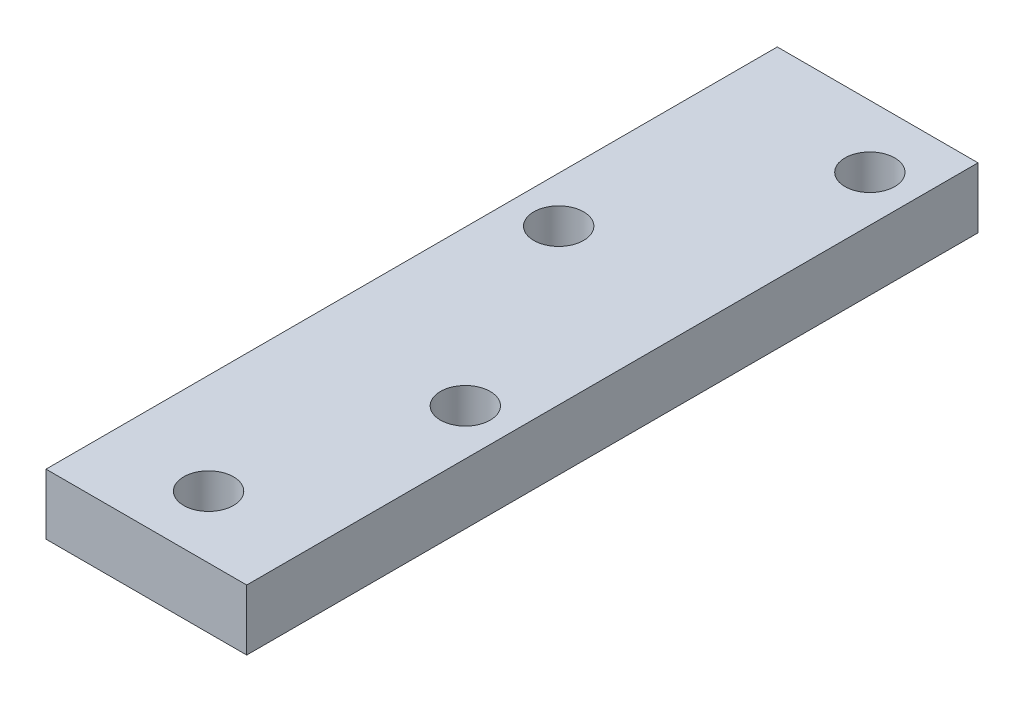
ISO-10303-21;
HEADER;
FILE_DESCRIPTION(('STEP AP214'),'2;1');
FILE_NAME('part.step','',(''),(''),'','','');
FILE_SCHEMA(('AUTOMOTIVE_DESIGN { 1 0 10303 214 1 1 1 1 }'));
ENDSEC;
DATA;
#1=APPLICATION_CONTEXT('core data for automotive mechanical design processes');
#2=APPLICATION_PROTOCOL_DEFINITION('international standard','automotive_design',2000,#1);
#3=PRODUCT_CONTEXT('',#1,'mechanical');
#4=PRODUCT('Part','Part','',(#3));
#5=PRODUCT_RELATED_PRODUCT_CATEGORY('part','',(#4));
#6=PRODUCT_DEFINITION_FORMATION('','',#4);
#7=PRODUCT_DEFINITION_CONTEXT('part definition',#1,'design');
#8=PRODUCT_DEFINITION('design','',#6,#7);
#9=PRODUCT_DEFINITION_SHAPE('','',#8);
#10=(LENGTH_UNIT() NAMED_UNIT(*) SI_UNIT(.MILLI.,.METRE.));
#11=(NAMED_UNIT(*) PLANE_ANGLE_UNIT() SI_UNIT($,.RADIAN.));
#12=(NAMED_UNIT(*) SI_UNIT($,.STERADIAN.) SOLID_ANGLE_UNIT());
#13=UNCERTAINTY_MEASURE_WITH_UNIT(LENGTH_MEASURE(1.E-05),#10,'distance_accuracy_value','');
#14=(GEOMETRIC_REPRESENTATION_CONTEXT(3) GLOBAL_UNCERTAINTY_ASSIGNED_CONTEXT((#13)) GLOBAL_UNIT_ASSIGNED_CONTEXT((#10,
#11,#12)) REPRESENTATION_CONTEXT('',''));
#15=CARTESIAN_POINT('',(0.,0.,0.));
#16=DIRECTION('',(0.,0.,1.));
#17=DIRECTION('',(1.,0.,0.));
#18=AXIS2_PLACEMENT_3D('',#15,#16,#17);
#19=CARTESIAN_POINT('',(-6.45,-1.95,54.));
#20=DIRECTION('',(1.,0.,0.));
#21=DIRECTION('',(0.,0.,-1.));
#22=AXIS2_PLACEMENT_3D('',#19,#20,#21);
#23=PLANE('',#22);
#24=DIRECTION('',(0.,0.,-1.));
#25=VECTOR('',#24,1.);
#26=CARTESIAN_POINT('',(-6.45,1.95,54.));
#27=LINE('',#26,#25);
#28=CARTESIAN_POINT('',(-6.45,1.95,54.));
#29=VERTEX_POINT('',#28);
#30=CARTESIAN_POINT('',(-6.45,1.95,7.00000000000001));
#31=VERTEX_POINT('',#30);
#32=EDGE_CURVE('E91',#29,#31,#27,.T.);
#33=ORIENTED_EDGE('',*,*,#32,.T.);
#34=DIRECTION('',(0.,-1.,0.));
#35=VECTOR('',#34,1.);
#36=CARTESIAN_POINT('',(-6.45,-1.95,7.));
#37=LINE('',#36,#35);
#38=CARTESIAN_POINT('',(-6.45,-1.95,7.));
#39=VERTEX_POINT('',#38);
#40=EDGE_CURVE('E50',#31,#39,#37,.T.);
#41=ORIENTED_EDGE('',*,*,#40,.T.);
#42=DIRECTION('',(0.,0.,-1.));
#43=VECTOR('',#42,1.);
#44=CARTESIAN_POINT('',(-6.45,-1.95,54.));
#45=LINE('',#44,#43);
#46=CARTESIAN_POINT('',(-6.45,-1.95,54.));
#47=VERTEX_POINT('',#46);
#48=EDGE_CURVE('E43',#47,#39,#45,.T.);
#49=ORIENTED_EDGE('',*,*,#48,.F.);
#50=DIRECTION('',(0.,-1.,0.));
#51=VECTOR('',#50,1.);
#52=CARTESIAN_POINT('',(-6.45,-1.95,54.));
#53=LINE('',#52,#51);
#54=EDGE_CURVE('E110',#29,#47,#53,.T.);
#55=ORIENTED_EDGE('',*,*,#54,.F.);
#56=EDGE_LOOP('',(#33,#41,#49,#55));
#57=FACE_BOUND('',#56,.T.);
#58=ADVANCED_FACE('F36',(#57),#23,.F.);
#59=CARTESIAN_POINT('',(6.45,-1.95,54.));
#60=DIRECTION('',(0.,1.,0.));
#61=DIRECTION('',(-1.,0.,0.));
#62=AXIS2_PLACEMENT_3D('',#59,#60,#61);
#63=PLANE('',#62);
#64=CARTESIAN_POINT('',(0.,-1.95,50.));
#65=DIRECTION('',(0.,-1.,0.));
#66=DIRECTION('',(1.,0.,0.));
#67=AXIS2_PLACEMENT_3D('',#64,#65,#66);
#68=CIRCLE('',#67,1.6);
#69=CARTESIAN_POINT('',(1.6,-1.95,50.));
#70=VERTEX_POINT('',#69);
#71=EDGE_CURVE('E126',#70,#70,#68,.T.);
#72=ORIENTED_EDGE('',*,*,#71,.F.);
#73=EDGE_LOOP('',(#72));
#74=FACE_BOUND('',#73,.T.);
#75=CARTESIAN_POINT('',(-3.5,-1.95,24.));
#76=DIRECTION('',(0.,-1.,0.));
#77=DIRECTION('',(1.,0.,0.));
#78=AXIS2_PLACEMENT_3D('',#75,#76,#77);
#79=CIRCLE('',#78,1.6);
#80=CARTESIAN_POINT('',(-1.9,-1.95,24.));
#81=VERTEX_POINT('',#80);
#82=EDGE_CURVE('E132',#81,#81,#79,.T.);
#83=ORIENTED_EDGE('',*,*,#82,.F.);
#84=EDGE_LOOP('',(#83));
#85=FACE_BOUND('',#84,.T.);
#86=CARTESIAN_POINT('',(3.5,-1.95,11.));
#87=DIRECTION('',(0.,-1.,0.));
#88=DIRECTION('',(1.,0.,0.));
#89=AXIS2_PLACEMENT_3D('',#86,#87,#88);
#90=CIRCLE('',#89,1.6);
#91=CARTESIAN_POINT('',(5.1,-1.95,11.));
#92=VERTEX_POINT('',#91);
#93=EDGE_CURVE('E129',#92,#92,#90,.T.);
#94=ORIENTED_EDGE('',*,*,#93,.F.);
#95=EDGE_LOOP('',(#94));
#96=FACE_BOUND('',#95,.T.);
#97=CARTESIAN_POINT('',(3.5,-1.95,37.));
#98=DIRECTION('',(0.,-1.,0.));
#99=DIRECTION('',(1.,0.,0.));
#100=AXIS2_PLACEMENT_3D('',#97,#98,#99);
#101=CIRCLE('',#100,1.6);
#102=CARTESIAN_POINT('',(5.1,-1.95,37.));
#103=VERTEX_POINT('',#102);
#104=EDGE_CURVE('E103',#103,#103,#101,.T.);
#105=ORIENTED_EDGE('',*,*,#104,.F.);
#106=EDGE_LOOP('',(#105));
#107=FACE_BOUND('',#106,.T.);
#108=ORIENTED_EDGE('',*,*,#48,.T.);
#109=DIRECTION('',(1.,0.,0.));
#110=VECTOR('',#109,1.);
#111=CARTESIAN_POINT('',(6.45,-1.95,7.));
#112=LINE('',#111,#110);
#113=CARTESIAN_POINT('',(6.45,-1.95,7.));
#114=VERTEX_POINT('',#113);
#115=EDGE_CURVE('E88',#39,#114,#112,.T.);
#116=ORIENTED_EDGE('',*,*,#115,.T.);
#117=DIRECTION('',(0.,0.,-1.));
#118=VECTOR('',#117,1.);
#119=CARTESIAN_POINT('',(6.45,-1.95,54.));
#120=LINE('',#119,#118);
#121=CARTESIAN_POINT('',(6.45,-1.95,54.));
#122=VERTEX_POINT('',#121);
#123=EDGE_CURVE('E87',#122,#114,#120,.T.);
#124=ORIENTED_EDGE('',*,*,#123,.F.);
#125=DIRECTION('',(1.,0.,0.));
#126=VECTOR('',#125,1.);
#127=CARTESIAN_POINT('',(6.45,-1.95,54.));
#128=LINE('',#127,#126);
#129=EDGE_CURVE('E113',#47,#122,#128,.T.);
#130=ORIENTED_EDGE('',*,*,#129,.F.);
#131=EDGE_LOOP('',(#108,#116,#124,#130));
#132=FACE_BOUND('',#131,.T.);
#133=ADVANCED_FACE('F124',(#74,#85,#96,#107,#132),#63,.F.);
#134=CARTESIAN_POINT('',(6.45,-1.95,54.));
#135=DIRECTION('',(-1.,0.,0.));
#136=DIRECTION('',(0.,0.,1.));
#137=AXIS2_PLACEMENT_3D('',#134,#135,#136);
#138=PLANE('',#137);
#139=ORIENTED_EDGE('',*,*,#123,.T.);
#140=DIRECTION('',(0.,1.,0.));
#141=VECTOR('',#140,1.);
#142=CARTESIAN_POINT('',(6.45,-1.95,7.));
#143=LINE('',#142,#141);
#144=CARTESIAN_POINT('',(6.45,1.95,7.));
#145=VERTEX_POINT('',#144);
#146=EDGE_CURVE('E75',#114,#145,#143,.T.);
#147=ORIENTED_EDGE('',*,*,#146,.T.);
#148=DIRECTION('',(0.,0.,-1.));
#149=VECTOR('',#148,1.);
#150=CARTESIAN_POINT('',(6.45,1.95,54.));
#151=LINE('',#150,#149);
#152=CARTESIAN_POINT('',(6.45,1.95,54.));
#153=VERTEX_POINT('',#152);
#154=EDGE_CURVE('E85',#153,#145,#151,.T.);
#155=ORIENTED_EDGE('',*,*,#154,.F.);
#156=DIRECTION('',(0.,1.,0.));
#157=VECTOR('',#156,1.);
#158=CARTESIAN_POINT('',(6.45,-1.95,54.));
#159=LINE('',#158,#157);
#160=EDGE_CURVE('E117',#122,#153,#159,.T.);
#161=ORIENTED_EDGE('',*,*,#160,.F.);
#162=EDGE_LOOP('',(#139,#147,#155,#161));
#163=FACE_BOUND('',#162,.T.);
#164=ADVANCED_FACE('F83',(#163),#138,.F.);
#165=CARTESIAN_POINT('',(6.45,1.95,54.));
#166=DIRECTION('',(0.,-1.,0.));
#167=DIRECTION('',(1.,0.,0.));
#168=AXIS2_PLACEMENT_3D('',#165,#166,#167);
#169=PLANE('',#168);
#170=CARTESIAN_POINT('',(0.,1.95000000000001,50.));
#171=DIRECTION('',(0.,-1.,0.));
#172=DIRECTION('',(1.,0.,0.));
#173=AXIS2_PLACEMENT_3D('',#170,#171,#172);
#174=CIRCLE('',#173,1.6);
#175=CARTESIAN_POINT('',(1.6,1.95000000000001,50.));
#176=VERTEX_POINT('',#175);
#177=EDGE_CURVE('E108',#176,#176,#174,.T.);
#178=ORIENTED_EDGE('',*,*,#177,.T.);
#179=EDGE_LOOP('',(#178));
#180=FACE_BOUND('',#179,.T.);
#181=CARTESIAN_POINT('',(-3.5,1.95000000000001,24.));
#182=DIRECTION('',(0.,-1.,0.));
#183=DIRECTION('',(1.,0.,0.));
#184=AXIS2_PLACEMENT_3D('',#181,#182,#183);
#185=CIRCLE('',#184,1.6);
#186=CARTESIAN_POINT('',(-1.9,1.95000000000001,24.));
#187=VERTEX_POINT('',#186);
#188=EDGE_CURVE('E106',#187,#187,#185,.T.);
#189=ORIENTED_EDGE('',*,*,#188,.T.);
#190=EDGE_LOOP('',(#189));
#191=FACE_BOUND('',#190,.T.);
#192=CARTESIAN_POINT('',(3.5,1.95000000000001,11.));
#193=DIRECTION('',(0.,-1.,0.));
#194=DIRECTION('',(1.,0.,0.));
#195=AXIS2_PLACEMENT_3D('',#192,#193,#194);
#196=CIRCLE('',#195,1.6);
#197=CARTESIAN_POINT('',(5.1,1.95000000000001,11.));
#198=VERTEX_POINT('',#197);
#199=EDGE_CURVE('E102',#198,#198,#196,.T.);
#200=ORIENTED_EDGE('',*,*,#199,.T.);
#201=EDGE_LOOP('',(#200));
#202=FACE_BOUND('',#201,.T.);
#203=CARTESIAN_POINT('',(3.5,1.95000000000001,37.));
#204=DIRECTION('',(0.,-1.,0.));
#205=DIRECTION('',(1.,0.,0.));
#206=AXIS2_PLACEMENT_3D('',#203,#204,#205);
#207=CIRCLE('',#206,1.6);
#208=CARTESIAN_POINT('',(5.1,1.95000000000001,37.));
#209=VERTEX_POINT('',#208);
#210=EDGE_CURVE('E99',#209,#209,#207,.T.);
#211=ORIENTED_EDGE('',*,*,#210,.T.);
#212=EDGE_LOOP('',(#211));
#213=FACE_BOUND('',#212,.T.);
#214=ORIENTED_EDGE('',*,*,#154,.T.);
#215=DIRECTION('',(-1.,0.,0.));
#216=VECTOR('',#215,1.);
#217=CARTESIAN_POINT('',(6.45,1.95,7.));
#218=LINE('',#217,#216);
#219=EDGE_CURVE('E11',#145,#31,#218,.T.);
#220=ORIENTED_EDGE('',*,*,#219,.T.);
#221=ORIENTED_EDGE('',*,*,#32,.F.);
#222=DIRECTION('',(-1.,0.,0.));
#223=VECTOR('',#222,1.);
#224=CARTESIAN_POINT('',(6.45,1.95,54.));
#225=LINE('',#224,#223);
#226=EDGE_CURVE('E57',#153,#29,#225,.T.);
#227=ORIENTED_EDGE('',*,*,#226,.F.);
#228=EDGE_LOOP('',(#214,#220,#221,#227));
#229=FACE_BOUND('',#228,.T.);
#230=ADVANCED_FACE('F90',(#180,#191,#202,#213,#229),#169,.F.);
#231=CARTESIAN_POINT('',(0.,0.,54.));
#232=DIRECTION('',(0.,0.,1.));
#233=DIRECTION('',(1.,0.,0.));
#234=AXIS2_PLACEMENT_3D('',#231,#232,#233);
#235=PLANE('',#234);
#236=ORIENTED_EDGE('',*,*,#54,.T.);
#237=ORIENTED_EDGE('',*,*,#129,.T.);
#238=ORIENTED_EDGE('',*,*,#160,.T.);
#239=ORIENTED_EDGE('',*,*,#226,.T.);
#240=EDGE_LOOP('',(#236,#237,#238,#239));
#241=FACE_BOUND('',#240,.T.);
#242=ADVANCED_FACE('F122',(#241),#235,.T.);
#243=CARTESIAN_POINT('',(3.49999999999995,354.05,37.));
#244=DIRECTION('',(0.,-1.,0.));
#245=DIRECTION('',(1.,0.,0.));
#246=AXIS2_PLACEMENT_3D('',#243,#244,#245);
#247=CYLINDRICAL_SURFACE('',#246,1.6);
#248=ORIENTED_EDGE('',*,*,#104,.T.);
#249=EDGE_LOOP('',(#248));
#250=FACE_BOUND('',#249,.T.);
#251=ORIENTED_EDGE('',*,*,#210,.F.);
#252=EDGE_LOOP('',(#251));
#253=FACE_BOUND('',#252,.T.);
#254=ADVANCED_FACE('F149',(#250,#253),#247,.F.);
#255=CARTESIAN_POINT('',(3.49999999999995,354.05,11.));
#256=DIRECTION('',(0.,-1.,0.));
#257=DIRECTION('',(1.,0.,0.));
#258=AXIS2_PLACEMENT_3D('',#255,#256,#257);
#259=CYLINDRICAL_SURFACE('',#258,1.6);
#260=ORIENTED_EDGE('',*,*,#93,.T.);
#261=EDGE_LOOP('',(#260));
#262=FACE_BOUND('',#261,.T.);
#263=ORIENTED_EDGE('',*,*,#199,.F.);
#264=EDGE_LOOP('',(#263));
#265=FACE_BOUND('',#264,.T.);
#266=ADVANCED_FACE('F152',(#262,#265),#259,.F.);
#267=CARTESIAN_POINT('',(-3.50000000000005,354.05,24.));
#268=DIRECTION('',(0.,-1.,0.));
#269=DIRECTION('',(1.,0.,0.));
#270=AXIS2_PLACEMENT_3D('',#267,#268,#269);
#271=CYLINDRICAL_SURFACE('',#270,1.6);
#272=ORIENTED_EDGE('',*,*,#82,.T.);
#273=EDGE_LOOP('',(#272));
#274=FACE_BOUND('',#273,.T.);
#275=ORIENTED_EDGE('',*,*,#188,.F.);
#276=EDGE_LOOP('',(#275));
#277=FACE_BOUND('',#276,.T.);
#278=ADVANCED_FACE('F199',(#274,#277),#271,.F.);
#279=CARTESIAN_POINT('',(0.,354.05,50.));
#280=DIRECTION('',(0.,-1.,0.));
#281=DIRECTION('',(1.,0.,0.));
#282=AXIS2_PLACEMENT_3D('',#279,#280,#281);
#283=CYLINDRICAL_SURFACE('',#282,1.6);
#284=ORIENTED_EDGE('',*,*,#71,.T.);
#285=EDGE_LOOP('',(#284));
#286=FACE_BOUND('',#285,.T.);
#287=ORIENTED_EDGE('',*,*,#177,.F.);
#288=EDGE_LOOP('',(#287));
#289=FACE_BOUND('',#288,.T.);
#290=ADVANCED_FACE('F137',(#286,#289),#283,.F.);
#291=CARTESIAN_POINT('',(-11.1427537195713,-8.05,7.));
#292=DIRECTION('',(0.,0.,1.));
#293=DIRECTION('',(1.,0.,0.));
#294=AXIS2_PLACEMENT_3D('',#291,#292,#293);
#295=PLANE('',#294);
#296=ORIENTED_EDGE('',*,*,#219,.F.);
#297=ORIENTED_EDGE('',*,*,#146,.F.);
#298=ORIENTED_EDGE('',*,*,#115,.F.);
#299=ORIENTED_EDGE('',*,*,#40,.F.);
#300=EDGE_LOOP('',(#296,#297,#298,#299));
#301=FACE_BOUND('',#300,.T.);
#302=ADVANCED_FACE('F74',(#301),#295,.F.);
#303=CLOSED_SHELL('',(#58,#133,#164,#230,#242,#254,#266,#278,#290,#302));
#304=MANIFOLD_SOLID_BREP('B2',#303);
#305=ADVANCED_BREP_SHAPE_REPRESENTATION('',(#18,#304),#14);
#306=SHAPE_DEFINITION_REPRESENTATION(#9,#305);
ENDSEC;
END-ISO-10303-21;
